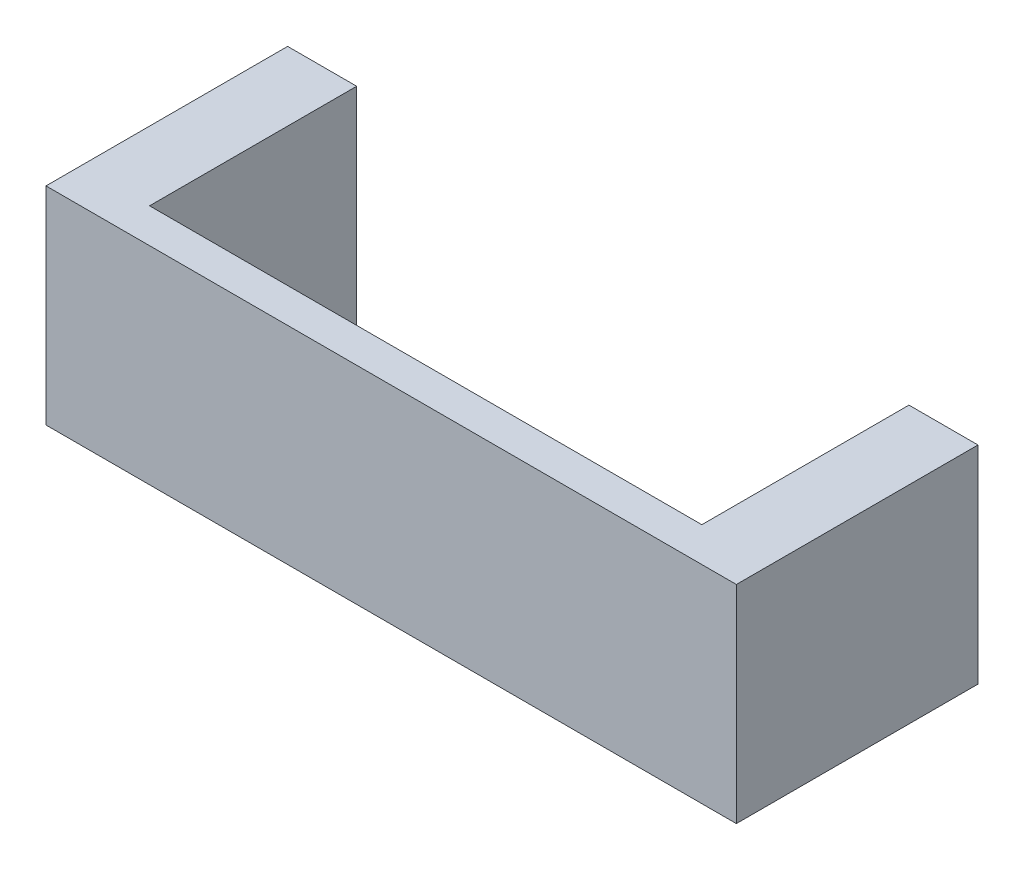
ISO-10303-21;
HEADER;
FILE_DESCRIPTION(('STEP AP214'),'2;1');
FILE_NAME('part.step','',(''),(''),'','','');
FILE_SCHEMA(('AUTOMOTIVE_DESIGN { 1 0 10303 214 1 1 1 1 }'));
ENDSEC;
DATA;
#1=APPLICATION_CONTEXT('core data for automotive mechanical design processes');
#2=APPLICATION_PROTOCOL_DEFINITION('international standard','automotive_design',2000,#1);
#3=PRODUCT_CONTEXT('',#1,'mechanical');
#4=PRODUCT('Part','Part','',(#3));
#5=PRODUCT_RELATED_PRODUCT_CATEGORY('part','',(#4));
#6=PRODUCT_DEFINITION_FORMATION('','',#4);
#7=PRODUCT_DEFINITION_CONTEXT('part definition',#1,'design');
#8=PRODUCT_DEFINITION('design','',#6,#7);
#9=PRODUCT_DEFINITION_SHAPE('','',#8);
#10=(LENGTH_UNIT() NAMED_UNIT(*) SI_UNIT(.MILLI.,.METRE.));
#11=(NAMED_UNIT(*) PLANE_ANGLE_UNIT() SI_UNIT($,.RADIAN.));
#12=(NAMED_UNIT(*) SI_UNIT($,.STERADIAN.) SOLID_ANGLE_UNIT());
#13=UNCERTAINTY_MEASURE_WITH_UNIT(LENGTH_MEASURE(1.E-05),#10,'distance_accuracy_value','');
#14=(GEOMETRIC_REPRESENTATION_CONTEXT(3) GLOBAL_UNCERTAINTY_ASSIGNED_CONTEXT((#13)) GLOBAL_UNIT_ASSIGNED_CONTEXT((#10,
#11,#12)) REPRESENTATION_CONTEXT('',''));
#15=CARTESIAN_POINT('',(0.,0.,0.));
#16=DIRECTION('',(0.,0.,1.));
#17=DIRECTION('',(1.,0.,0.));
#18=AXIS2_PLACEMENT_3D('',#15,#16,#17);
#19=CARTESIAN_POINT('',(-50.,30.,0.));
#20=DIRECTION('',(1.,0.,0.));
#21=DIRECTION('',(0.,0.,-1.));
#22=AXIS2_PLACEMENT_3D('',#19,#20,#21);
#23=PLANE('',#22);
#24=DIRECTION('',(0.,0.,1.));
#25=VECTOR('',#24,1.);
#26=CARTESIAN_POINT('',(-50.,0.,0.));
#27=LINE('',#26,#25);
#28=CARTESIAN_POINT('',(-50.,0.,0.));
#29=VERTEX_POINT('',#28);
#30=CARTESIAN_POINT('',(-50.,0.,35.));
#31=VERTEX_POINT('',#30);
#32=EDGE_CURVE('E132',#29,#31,#27,.T.);
#33=ORIENTED_EDGE('',*,*,#32,.T.);
#34=DIRECTION('',(0.,-1.,0.));
#35=VECTOR('',#34,1.);
#36=CARTESIAN_POINT('',(-50.,30.,35.));
#37=LINE('',#36,#35);
#38=CARTESIAN_POINT('',(-50.,30.,35.));
#39=VERTEX_POINT('',#38);
#40=EDGE_CURVE('E11',#39,#31,#37,.T.);
#41=ORIENTED_EDGE('',*,*,#40,.F.);
#42=DIRECTION('',(0.,0.,1.));
#43=VECTOR('',#42,1.);
#44=CARTESIAN_POINT('',(-50.,30.,0.));
#45=LINE('',#44,#43);
#46=CARTESIAN_POINT('',(-50.,30.,0.));
#47=VERTEX_POINT('',#46);
#48=EDGE_CURVE('E146',#47,#39,#45,.T.);
#49=ORIENTED_EDGE('',*,*,#48,.F.);
#50=DIRECTION('',(0.,-1.,0.));
#51=VECTOR('',#50,1.);
#52=CARTESIAN_POINT('',(-50.,30.,0.));
#53=LINE('',#52,#51);
#54=EDGE_CURVE('E128',#47,#29,#53,.T.);
#55=ORIENTED_EDGE('',*,*,#54,.T.);
#56=EDGE_LOOP('',(#33,#41,#49,#55));
#57=FACE_BOUND('',#56,.T.);
#58=ADVANCED_FACE('F36',(#57),#23,.F.);
#59=CARTESIAN_POINT('',(-50.,30.,35.));
#60=DIRECTION('',(0.,0.,-1.));
#61=DIRECTION('',(-1.,0.,0.));
#62=AXIS2_PLACEMENT_3D('',#59,#60,#61);
#63=PLANE('',#62);
#64=DIRECTION('',(1.,0.,0.));
#65=VECTOR('',#64,1.);
#66=CARTESIAN_POINT('',(-50.,0.,35.));
#67=LINE('',#66,#65);
#68=CARTESIAN_POINT('',(50.,0.,35.));
#69=VERTEX_POINT('',#68);
#70=EDGE_CURVE('E135',#31,#69,#67,.T.);
#71=ORIENTED_EDGE('',*,*,#70,.T.);
#72=DIRECTION('',(0.,-1.,0.));
#73=VECTOR('',#72,1.);
#74=CARTESIAN_POINT('',(50.,30.,35.));
#75=LINE('',#74,#73);
#76=CARTESIAN_POINT('',(50.,30.,35.));
#77=VERTEX_POINT('',#76);
#78=EDGE_CURVE('E44',#77,#69,#75,.T.);
#79=ORIENTED_EDGE('',*,*,#78,.F.);
#80=DIRECTION('',(1.,0.,0.));
#81=VECTOR('',#80,1.);
#82=CARTESIAN_POINT('',(-50.,30.,35.));
#83=LINE('',#82,#81);
#84=EDGE_CURVE('E95',#39,#77,#83,.T.);
#85=ORIENTED_EDGE('',*,*,#84,.F.);
#86=ORIENTED_EDGE('',*,*,#40,.T.);
#87=EDGE_LOOP('',(#71,#79,#85,#86));
#88=FACE_BOUND('',#87,.T.);
#89=ADVANCED_FACE('F181',(#88),#63,.F.);
#90=CARTESIAN_POINT('',(50.,30.,0.));
#91=DIRECTION('',(-1.,0.,0.));
#92=DIRECTION('',(0.,0.,1.));
#93=AXIS2_PLACEMENT_3D('',#90,#91,#92);
#94=PLANE('',#93);
#95=DIRECTION('',(0.,0.,-1.));
#96=VECTOR('',#95,1.);
#97=CARTESIAN_POINT('',(50.,0.,0.));
#98=LINE('',#97,#96);
#99=CARTESIAN_POINT('',(50.,0.,0.));
#100=VERTEX_POINT('',#99);
#101=EDGE_CURVE('E137',#69,#100,#98,.T.);
#102=ORIENTED_EDGE('',*,*,#101,.T.);
#103=DIRECTION('',(0.,-1.,0.));
#104=VECTOR('',#103,1.);
#105=CARTESIAN_POINT('',(50.,30.,0.));
#106=LINE('',#105,#104);
#107=CARTESIAN_POINT('',(50.,30.,0.));
#108=VERTEX_POINT('',#107);
#109=EDGE_CURVE('E153',#108,#100,#106,.T.);
#110=ORIENTED_EDGE('',*,*,#109,.F.);
#111=DIRECTION('',(0.,0.,-1.));
#112=VECTOR('',#111,1.);
#113=CARTESIAN_POINT('',(50.,30.,0.));
#114=LINE('',#113,#112);
#115=EDGE_CURVE('E161',#77,#108,#114,.T.);
#116=ORIENTED_EDGE('',*,*,#115,.F.);
#117=ORIENTED_EDGE('',*,*,#78,.T.);
#118=EDGE_LOOP('',(#102,#110,#116,#117));
#119=FACE_BOUND('',#118,.T.);
#120=ADVANCED_FACE('F159',(#119),#94,.F.);
#121=CARTESIAN_POINT('',(50.,30.,0.));
#122=DIRECTION('',(0.,0.,1.));
#123=DIRECTION('',(1.,0.,0.));
#124=AXIS2_PLACEMENT_3D('',#121,#122,#123);
#125=PLANE('',#124);
#126=DIRECTION('',(-1.,0.,0.));
#127=VECTOR('',#126,1.);
#128=CARTESIAN_POINT('',(50.,0.,0.));
#129=LINE('',#128,#127);
#130=CARTESIAN_POINT('',(40.,0.,0.));
#131=VERTEX_POINT('',#130);
#132=EDGE_CURVE('E139',#100,#131,#129,.T.);
#133=ORIENTED_EDGE('',*,*,#132,.T.);
#134=DIRECTION('',(0.,-1.,0.));
#135=VECTOR('',#134,1.);
#136=CARTESIAN_POINT('',(40.,30.,0.));
#137=LINE('',#136,#135);
#138=CARTESIAN_POINT('',(40.,30.,0.));
#139=VERTEX_POINT('',#138);
#140=EDGE_CURVE('E150',#139,#131,#137,.T.);
#141=ORIENTED_EDGE('',*,*,#140,.F.);
#142=DIRECTION('',(-1.,0.,0.));
#143=VECTOR('',#142,1.);
#144=CARTESIAN_POINT('',(50.,30.,0.));
#145=LINE('',#144,#143);
#146=EDGE_CURVE('E173',#108,#139,#145,.T.);
#147=ORIENTED_EDGE('',*,*,#146,.F.);
#148=ORIENTED_EDGE('',*,*,#109,.T.);
#149=EDGE_LOOP('',(#133,#141,#147,#148));
#150=FACE_BOUND('',#149,.T.);
#151=ADVANCED_FACE('F169',(#150),#125,.F.);
#152=CARTESIAN_POINT('',(40.,30.,0.));
#153=DIRECTION('',(1.,0.,0.));
#154=DIRECTION('',(0.,0.,-1.));
#155=AXIS2_PLACEMENT_3D('',#152,#153,#154);
#156=PLANE('',#155);
#157=DIRECTION('',(0.,0.,1.));
#158=VECTOR('',#157,1.);
#159=CARTESIAN_POINT('',(40.,0.,0.));
#160=LINE('',#159,#158);
#161=CARTESIAN_POINT('',(40.,0.,30.));
#162=VERTEX_POINT('',#161);
#163=EDGE_CURVE('E141',#131,#162,#160,.T.);
#164=ORIENTED_EDGE('',*,*,#163,.T.);
#165=DIRECTION('',(0.,-1.,0.));
#166=VECTOR('',#165,1.);
#167=CARTESIAN_POINT('',(40.,30.,30.));
#168=LINE('',#167,#166);
#169=CARTESIAN_POINT('',(40.,30.,30.));
#170=VERTEX_POINT('',#169);
#171=EDGE_CURVE('E123',#170,#162,#168,.T.);
#172=ORIENTED_EDGE('',*,*,#171,.F.);
#173=DIRECTION('',(0.,0.,1.));
#174=VECTOR('',#173,1.);
#175=CARTESIAN_POINT('',(40.,30.,0.));
#176=LINE('',#175,#174);
#177=EDGE_CURVE('E114',#139,#170,#176,.T.);
#178=ORIENTED_EDGE('',*,*,#177,.F.);
#179=ORIENTED_EDGE('',*,*,#140,.T.);
#180=EDGE_LOOP('',(#164,#172,#178,#179));
#181=FACE_BOUND('',#180,.T.);
#182=ADVANCED_FACE('F172',(#181),#156,.F.);
#183=CARTESIAN_POINT('',(-40.,30.,30.));
#184=DIRECTION('',(0.,0.,1.));
#185=DIRECTION('',(1.,0.,0.));
#186=AXIS2_PLACEMENT_3D('',#183,#184,#185);
#187=PLANE('',#186);
#188=DIRECTION('',(-1.,0.,0.));
#189=VECTOR('',#188,1.);
#190=CARTESIAN_POINT('',(-40.,0.,30.));
#191=LINE('',#190,#189);
#192=CARTESIAN_POINT('',(-40.,0.,30.));
#193=VERTEX_POINT('',#192);
#194=EDGE_CURVE('E122',#162,#193,#191,.T.);
#195=ORIENTED_EDGE('',*,*,#194,.T.);
#196=DIRECTION('',(0.,-1.,0.));
#197=VECTOR('',#196,1.);
#198=CARTESIAN_POINT('',(-40.,30.,30.));
#199=LINE('',#198,#197);
#200=CARTESIAN_POINT('',(-40.,30.,30.));
#201=VERTEX_POINT('',#200);
#202=EDGE_CURVE('E119',#201,#193,#199,.T.);
#203=ORIENTED_EDGE('',*,*,#202,.F.);
#204=DIRECTION('',(-1.,0.,0.));
#205=VECTOR('',#204,1.);
#206=CARTESIAN_POINT('',(-40.,30.,30.));
#207=LINE('',#206,#205);
#208=EDGE_CURVE('E108',#170,#201,#207,.T.);
#209=ORIENTED_EDGE('',*,*,#208,.F.);
#210=ORIENTED_EDGE('',*,*,#171,.T.);
#211=EDGE_LOOP('',(#195,#203,#209,#210));
#212=FACE_BOUND('',#211,.T.);
#213=ADVANCED_FACE('F120',(#212),#187,.F.);
#214=CARTESIAN_POINT('',(-40.,30.,0.));
#215=DIRECTION('',(-1.,0.,0.));
#216=DIRECTION('',(0.,0.,1.));
#217=AXIS2_PLACEMENT_3D('',#214,#215,#216);
#218=PLANE('',#217);
#219=DIRECTION('',(0.,0.,-1.));
#220=VECTOR('',#219,1.);
#221=CARTESIAN_POINT('',(-40.,0.,0.));
#222=LINE('',#221,#220);
#223=CARTESIAN_POINT('',(-40.,0.,0.));
#224=VERTEX_POINT('',#223);
#225=EDGE_CURVE('E81',#193,#224,#222,.T.);
#226=ORIENTED_EDGE('',*,*,#225,.T.);
#227=DIRECTION('',(0.,-1.,0.));
#228=VECTOR('',#227,1.);
#229=CARTESIAN_POINT('',(-40.,30.,0.));
#230=LINE('',#229,#228);
#231=CARTESIAN_POINT('',(-40.,30.,0.));
#232=VERTEX_POINT('',#231);
#233=EDGE_CURVE('E124',#232,#224,#230,.T.);
#234=ORIENTED_EDGE('',*,*,#233,.F.);
#235=DIRECTION('',(0.,0.,-1.));
#236=VECTOR('',#235,1.);
#237=CARTESIAN_POINT('',(-40.,30.,0.));
#238=LINE('',#237,#236);
#239=EDGE_CURVE('E112',#201,#232,#238,.T.);
#240=ORIENTED_EDGE('',*,*,#239,.F.);
#241=ORIENTED_EDGE('',*,*,#202,.T.);
#242=EDGE_LOOP('',(#226,#234,#240,#241));
#243=FACE_BOUND('',#242,.T.);
#244=ADVANCED_FACE('F126',(#243),#218,.F.);
#245=CARTESIAN_POINT('',(-50.,30.,0.));
#246=DIRECTION('',(0.,0.,1.));
#247=DIRECTION('',(1.,0.,0.));
#248=AXIS2_PLACEMENT_3D('',#245,#246,#247);
#249=PLANE('',#248);
#250=DIRECTION('',(-1.,0.,0.));
#251=VECTOR('',#250,1.);
#252=CARTESIAN_POINT('',(-50.,0.,0.));
#253=LINE('',#252,#251);
#254=EDGE_CURVE('E87',#224,#29,#253,.T.);
#255=ORIENTED_EDGE('',*,*,#254,.T.);
#256=ORIENTED_EDGE('',*,*,#54,.F.);
#257=DIRECTION('',(-1.,0.,0.));
#258=VECTOR('',#257,1.);
#259=CARTESIAN_POINT('',(-50.,30.,0.));
#260=LINE('',#259,#258);
#261=EDGE_CURVE('E52',#232,#47,#260,.T.);
#262=ORIENTED_EDGE('',*,*,#261,.F.);
#263=ORIENTED_EDGE('',*,*,#233,.T.);
#264=EDGE_LOOP('',(#255,#256,#262,#263));
#265=FACE_BOUND('',#264,.T.);
#266=ADVANCED_FACE('F197',(#265),#249,.F.);
#267=CARTESIAN_POINT('',(0.,30.,0.));
#268=DIRECTION('',(0.,1.,0.));
#269=DIRECTION('',(0.,0.,1.));
#270=AXIS2_PLACEMENT_3D('',#267,#268,#269);
#271=PLANE('',#270);
#272=ORIENTED_EDGE('',*,*,#48,.T.);
#273=ORIENTED_EDGE('',*,*,#84,.T.);
#274=ORIENTED_EDGE('',*,*,#115,.T.);
#275=ORIENTED_EDGE('',*,*,#146,.T.);
#276=ORIENTED_EDGE('',*,*,#177,.T.);
#277=ORIENTED_EDGE('',*,*,#208,.T.);
#278=ORIENTED_EDGE('',*,*,#239,.T.);
#279=ORIENTED_EDGE('',*,*,#261,.T.);
#280=EDGE_LOOP('',(#272,#273,#274,#275,#276,#277,#278,#279));
#281=FACE_BOUND('',#280,.T.);
#282=ADVANCED_FACE('F110',(#281),#271,.T.);
#283=CARTESIAN_POINT('',(0.,0.,0.));
#284=DIRECTION('',(0.,1.,0.));
#285=DIRECTION('',(0.,0.,1.));
#286=AXIS2_PLACEMENT_3D('',#283,#284,#285);
#287=PLANE('',#286);
#288=ORIENTED_EDGE('',*,*,#32,.F.);
#289=ORIENTED_EDGE('',*,*,#254,.F.);
#290=ORIENTED_EDGE('',*,*,#225,.F.);
#291=ORIENTED_EDGE('',*,*,#194,.F.);
#292=ORIENTED_EDGE('',*,*,#163,.F.);
#293=ORIENTED_EDGE('',*,*,#132,.F.);
#294=ORIENTED_EDGE('',*,*,#101,.F.);
#295=ORIENTED_EDGE('',*,*,#70,.F.);
#296=EDGE_LOOP('',(#288,#289,#290,#291,#292,#293,#294,#295));
#297=FACE_BOUND('',#296,.T.);
#298=ADVANCED_FACE('F165',(#297),#287,.F.);
#299=CLOSED_SHELL('',(#58,#89,#120,#151,#182,#213,#244,#266,#282,#298));
#300=MANIFOLD_SOLID_BREP('B2',#299);
#301=ADVANCED_BREP_SHAPE_REPRESENTATION('',(#18,#300),#14);
#302=SHAPE_DEFINITION_REPRESENTATION(#9,#301);
ENDSEC;
END-ISO-10303-21;
